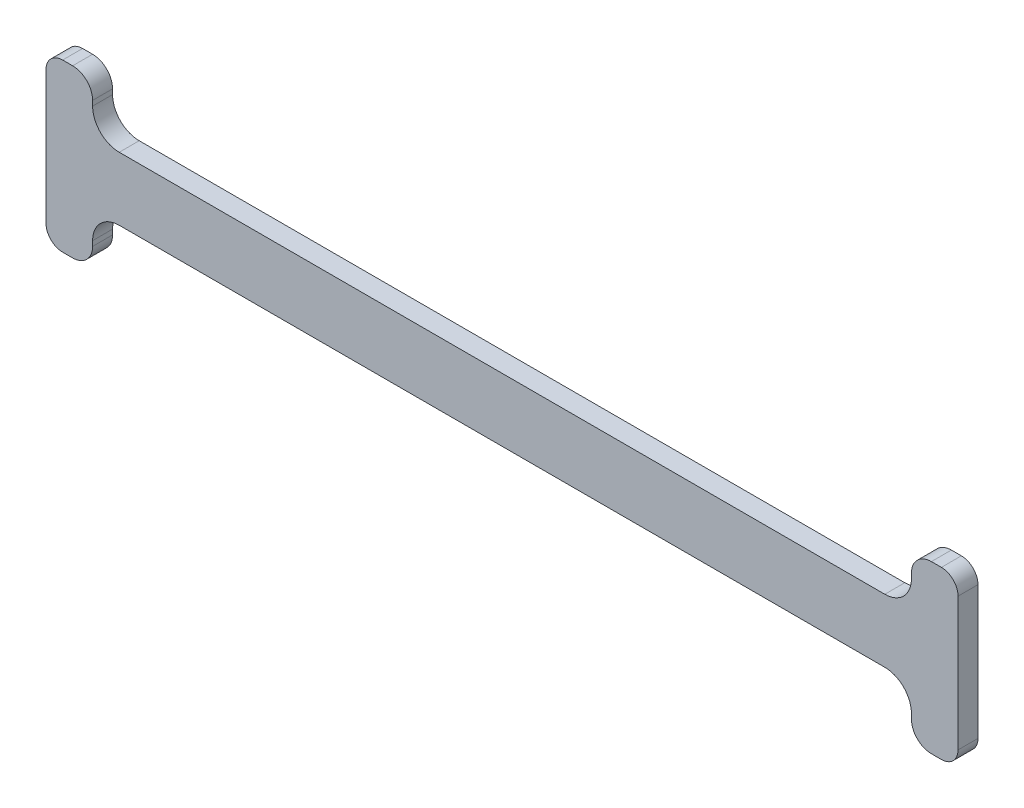
ISO-10303-21;
HEADER;
FILE_DESCRIPTION(('STEP AP214'),'2;1');
FILE_NAME('part.step','',(''),(''),'','','');
FILE_SCHEMA(('AUTOMOTIVE_DESIGN { 1 0 10303 214 1 1 1 1 }'));
ENDSEC;
DATA;
#1=APPLICATION_CONTEXT('core data for automotive mechanical design processes');
#2=APPLICATION_PROTOCOL_DEFINITION('international standard','automotive_design',2000,#1);
#3=PRODUCT_CONTEXT('',#1,'mechanical');
#4=PRODUCT('Part','Part','',(#3));
#5=PRODUCT_RELATED_PRODUCT_CATEGORY('part','',(#4));
#6=PRODUCT_DEFINITION_FORMATION('','',#4);
#7=PRODUCT_DEFINITION_CONTEXT('part definition',#1,'design');
#8=PRODUCT_DEFINITION('design','',#6,#7);
#9=PRODUCT_DEFINITION_SHAPE('','',#8);
#10=(LENGTH_UNIT() NAMED_UNIT(*) SI_UNIT(.MILLI.,.METRE.));
#11=(NAMED_UNIT(*) PLANE_ANGLE_UNIT() SI_UNIT($,.RADIAN.));
#12=(NAMED_UNIT(*) SI_UNIT($,.STERADIAN.) SOLID_ANGLE_UNIT());
#13=UNCERTAINTY_MEASURE_WITH_UNIT(LENGTH_MEASURE(1.E-05),#10,'distance_accuracy_value','');
#14=(GEOMETRIC_REPRESENTATION_CONTEXT(3) GLOBAL_UNCERTAINTY_ASSIGNED_CONTEXT((#13)) GLOBAL_UNIT_ASSIGNED_CONTEXT((#10,
#11,#12)) REPRESENTATION_CONTEXT('',''));
#15=CARTESIAN_POINT('',(0.,0.,0.));
#16=DIRECTION('',(0.,0.,1.));
#17=DIRECTION('',(1.,0.,0.));
#18=AXIS2_PLACEMENT_3D('',#15,#16,#17);
#19=CARTESIAN_POINT('',(1082.49799277824,802.036028313114,6.));
#20=DIRECTION('',(0.,1.,0.));
#21=DIRECTION('',(0.,0.,1.));
#22=AXIS2_PLACEMENT_3D('',#19,#20,#21);
#23=PLANE('',#22);
#24=DIRECTION('',(1.,0.,0.));
#25=VECTOR('',#24,1.);
#26=CARTESIAN_POINT('',(1082.49799277824,802.036028313114,0.));
#27=LINE('',#26,#25);
#28=CARTESIAN_POINT('',(1082.49799277824,802.036028313114,0.));
#29=VERTEX_POINT('',#28);
#30=CARTESIAN_POINT('',(1312.49799277825,802.036028313114,0.));
#31=VERTEX_POINT('',#30);
#32=EDGE_CURVE('E11',#29,#31,#27,.T.);
#33=ORIENTED_EDGE('',*,*,#32,.T.);
#34=DIRECTION('',(0.,0.,-1.));
#35=VECTOR('',#34,1.);
#36=CARTESIAN_POINT('',(1312.49799277825,802.036028313114,6.));
#37=LINE('',#36,#35);
#38=CARTESIAN_POINT('',(1312.49799277825,802.036028313114,6.));
#39=VERTEX_POINT('',#38);
#40=EDGE_CURVE('E54',#39,#31,#37,.T.);
#41=ORIENTED_EDGE('',*,*,#40,.F.);
#42=DIRECTION('',(1.,0.,0.));
#43=VECTOR('',#42,1.);
#44=CARTESIAN_POINT('',(1082.49799277824,802.036028313114,6.));
#45=LINE('',#44,#43);
#46=CARTESIAN_POINT('',(1082.49799277824,802.036028313114,6.));
#47=VERTEX_POINT('',#46);
#48=EDGE_CURVE('E39',#47,#39,#45,.T.);
#49=ORIENTED_EDGE('',*,*,#48,.F.);
#50=DIRECTION('',(0.,0.,-1.));
#51=VECTOR('',#50,1.);
#52=CARTESIAN_POINT('',(1082.49799277824,802.036028313114,6.));
#53=LINE('',#52,#51);
#54=EDGE_CURVE('E139',#47,#29,#53,.T.);
#55=ORIENTED_EDGE('',*,*,#54,.T.);
#56=EDGE_LOOP('',(#33,#41,#49,#55));
#57=FACE_BOUND('',#56,.T.);
#58=ADVANCED_FACE('F35',(#57),#23,.F.);
#59=CARTESIAN_POINT('',(1312.49799277825,794.036028312865,6.));
#60=DIRECTION('',(0.,0.,-1.));
#61=DIRECTION('',(-1.,0.,0.));
#62=AXIS2_PLACEMENT_3D('',#59,#60,#61);
#63=CYLINDRICAL_SURFACE('',#62,8.00000000024848);
#64=CARTESIAN_POINT('',(1312.49799277825,794.036028312865,0.));
#65=DIRECTION('',(0.,0.,1.));
#66=DIRECTION('',(1.,0.,0.));
#67=AXIS2_PLACEMENT_3D('',#64,#65,#66);
#68=CIRCLE('',#67,8.00000000024848);
#69=CARTESIAN_POINT('',(1320.4979927785,794.036028313431,0.));
#70=VERTEX_POINT('',#69);
#71=EDGE_CURVE('E45',#70,#31,#68,.T.);
#72=ORIENTED_EDGE('',*,*,#71,.F.);
#73=DIRECTION('',(0.,0.,-1.));
#74=VECTOR('',#73,1.);
#75=CARTESIAN_POINT('',(1320.4979927785,794.036028313431,6.));
#76=LINE('',#75,#74);
#77=CARTESIAN_POINT('',(1320.4979927785,794.036028313431,6.));
#78=VERTEX_POINT('',#77);
#79=EDGE_CURVE('E127',#78,#70,#76,.T.);
#80=ORIENTED_EDGE('',*,*,#79,.F.);
#81=CARTESIAN_POINT('',(1312.49799277825,794.036028312865,6.));
#82=DIRECTION('',(0.,0.,1.));
#83=DIRECTION('',(1.,0.,0.));
#84=AXIS2_PLACEMENT_3D('',#81,#82,#83);
#85=CIRCLE('',#84,8.00000000024848);
#86=EDGE_CURVE('E278',#78,#39,#85,.T.);
#87=ORIENTED_EDGE('',*,*,#86,.T.);
#88=ORIENTED_EDGE('',*,*,#40,.T.);
#89=EDGE_LOOP('',(#72,#80,#87,#88));
#90=FACE_BOUND('',#89,.T.);
#91=ADVANCED_FACE('F478',(#90),#63,.F.);
#92=CARTESIAN_POINT('',(1320.4979927785,794.036028313431,6.));
#93=DIRECTION('',(1.,0.,0.));
#94=DIRECTION('',(0.,0.,-1.));
#95=AXIS2_PLACEMENT_3D('',#92,#93,#94);
#96=PLANE('',#95);
#97=DIRECTION('',(0.,-1.,0.));
#98=VECTOR('',#97,1.);
#99=CARTESIAN_POINT('',(1320.4979927785,794.036028313431,0.));
#100=LINE('',#99,#98);
#101=CARTESIAN_POINT('',(1320.4979927785,792.536030360595,0.));
#102=VERTEX_POINT('',#101);
#103=EDGE_CURVE('E204',#70,#102,#100,.T.);
#104=ORIENTED_EDGE('',*,*,#103,.T.);
#105=DIRECTION('',(0.,0.,-1.));
#106=VECTOR('',#105,1.);
#107=CARTESIAN_POINT('',(1320.4979927785,792.536030360595,6.));
#108=LINE('',#107,#106);
#109=CARTESIAN_POINT('',(1320.4979927785,792.536030360595,6.));
#110=VERTEX_POINT('',#109);
#111=EDGE_CURVE('E207',#110,#102,#108,.T.);
#112=ORIENTED_EDGE('',*,*,#111,.F.);
#113=DIRECTION('',(0.,-1.,0.));
#114=VECTOR('',#113,1.);
#115=CARTESIAN_POINT('',(1320.4979927785,794.036028313431,6.));
#116=LINE('',#115,#114);
#117=EDGE_CURVE('E277',#78,#110,#116,.T.);
#118=ORIENTED_EDGE('',*,*,#117,.F.);
#119=ORIENTED_EDGE('',*,*,#79,.T.);
#120=EDGE_LOOP('',(#104,#112,#118,#119));
#121=FACE_BOUND('',#120,.T.);
#122=ADVANCED_FACE('F206',(#121),#96,.F.);
#123=CARTESIAN_POINT('',(1326.49799584903,792.53603138364,6.));
#124=DIRECTION('',(0.,0.,-1.));
#125=DIRECTION('',(-1.,0.,0.));
#126=AXIS2_PLACEMENT_3D('',#123,#124,#125);
#127=CYLINDRICAL_SURFACE('',#126,6.00000307052947);
#128=CARTESIAN_POINT('',(1326.49799584903,792.53603138364,0.));
#129=DIRECTION('',(0.,0.,1.));
#130=DIRECTION('',(1.,0.,0.));
#131=AXIS2_PLACEMENT_3D('',#128,#129,#130);
#132=CIRCLE('',#131,6.00000307052947);
#133=CARTESIAN_POINT('',(1326.49799397723,786.536028313111,0.));
#134=VERTEX_POINT('',#133);
#135=EDGE_CURVE('E212',#102,#134,#132,.T.);
#136=ORIENTED_EDGE('',*,*,#135,.T.);
#137=DIRECTION('',(0.,0.,-1.));
#138=VECTOR('',#137,1.);
#139=CARTESIAN_POINT('',(1326.49799397723,786.536028313111,6.));
#140=LINE('',#139,#138);
#141=CARTESIAN_POINT('',(1326.49799397723,786.536028313111,6.));
#142=VERTEX_POINT('',#141);
#143=EDGE_CURVE('E219',#142,#134,#140,.T.);
#144=ORIENTED_EDGE('',*,*,#143,.F.);
#145=CARTESIAN_POINT('',(1326.49799584903,792.53603138364,6.));
#146=DIRECTION('',(0.,0.,1.));
#147=DIRECTION('',(1.,0.,0.));
#148=AXIS2_PLACEMENT_3D('',#145,#146,#147);
#149=CIRCLE('',#148,6.00000307052947);
#150=EDGE_CURVE('E218',#110,#142,#149,.T.);
#151=ORIENTED_EDGE('',*,*,#150,.F.);
#152=ORIENTED_EDGE('',*,*,#111,.T.);
#153=EDGE_LOOP('',(#136,#144,#151,#152));
#154=FACE_BOUND('',#153,.T.);
#155=ADVANCED_FACE('F215',(#154),#127,.T.);
#156=CARTESIAN_POINT('',(1326.49799397723,786.536028313111,6.));
#157=DIRECTION('',(-6.34307674780926E-11,1.,0.));
#158=DIRECTION('',(-1.,-6.34307674780926E-11,0.));
#159=AXIS2_PLACEMENT_3D('',#156,#157,#158);
#160=PLANE('',#159);
#161=DIRECTION('',(1.,6.34307674780926E-11,0.));
#162=VECTOR('',#161,1.);
#163=CARTESIAN_POINT('',(1326.49799397723,786.536028313111,0.));
#164=LINE('',#163,#162);
#165=CARTESIAN_POINT('',(1329.49799277886,786.536028313301,0.));
#166=VERTEX_POINT('',#165);
#167=EDGE_CURVE('E224',#134,#166,#164,.T.);
#168=ORIENTED_EDGE('',*,*,#167,.T.);
#169=DIRECTION('',(0.,0.,-1.));
#170=VECTOR('',#169,1.);
#171=CARTESIAN_POINT('',(1329.49799277886,786.536028313301,6.));
#172=LINE('',#171,#170);
#173=CARTESIAN_POINT('',(1329.49799277886,786.536028313301,6.));
#174=VERTEX_POINT('',#173);
#175=EDGE_CURVE('E334',#174,#166,#172,.T.);
#176=ORIENTED_EDGE('',*,*,#175,.F.);
#177=DIRECTION('',(1.,6.34307674780926E-11,0.));
#178=VECTOR('',#177,1.);
#179=CARTESIAN_POINT('',(1326.49799397723,786.536028313111,6.));
#180=LINE('',#179,#178);
#181=EDGE_CURVE('E274',#142,#174,#180,.T.);
#182=ORIENTED_EDGE('',*,*,#181,.F.);
#183=ORIENTED_EDGE('',*,*,#143,.T.);
#184=EDGE_LOOP('',(#168,#176,#182,#183));
#185=FACE_BOUND('',#184,.T.);
#186=ADVANCED_FACE('F466',(#185),#160,.F.);
#187=CARTESIAN_POINT('',(1329.49799277854,791.536028313301,6.));
#188=DIRECTION('',(0.,0.,-1.));
#189=DIRECTION('',(-1.,0.,0.));
#190=AXIS2_PLACEMENT_3D('',#187,#188,#189);
#191=CYLINDRICAL_SURFACE('',#190,5.00000000000006);
#192=CARTESIAN_POINT('',(1329.49799277854,791.536028313301,0.));
#193=DIRECTION('',(0.,0.,1.));
#194=DIRECTION('',(1.,0.,0.));
#195=AXIS2_PLACEMENT_3D('',#192,#193,#194);
#196=CIRCLE('',#195,5.00000000000006);
#197=CARTESIAN_POINT('',(1334.49799277854,791.536028313302,0.));
#198=VERTEX_POINT('',#197);
#199=EDGE_CURVE('E226',#166,#198,#196,.T.);
#200=ORIENTED_EDGE('',*,*,#199,.T.);
#201=DIRECTION('',(0.,0.,-1.));
#202=VECTOR('',#201,1.);
#203=CARTESIAN_POINT('',(1334.49799277854,791.536028313302,6.));
#204=LINE('',#203,#202);
#205=CARTESIAN_POINT('',(1334.49799277854,791.536028313302,6.));
#206=VERTEX_POINT('',#205);
#207=EDGE_CURVE('E332',#206,#198,#204,.T.);
#208=ORIENTED_EDGE('',*,*,#207,.F.);
#209=CARTESIAN_POINT('',(1329.49799277854,791.536028313301,6.));
#210=DIRECTION('',(0.,0.,1.));
#211=DIRECTION('',(1.,0.,0.));
#212=AXIS2_PLACEMENT_3D('',#209,#210,#211);
#213=CIRCLE('',#212,5.00000000000006);
#214=EDGE_CURVE('E272',#174,#206,#213,.T.);
#215=ORIENTED_EDGE('',*,*,#214,.F.);
#216=ORIENTED_EDGE('',*,*,#175,.T.);
#217=EDGE_LOOP('',(#200,#208,#215,#216));
#218=FACE_BOUND('',#217,.T.);
#219=ADVANCED_FACE('F330',(#218),#191,.T.);
#220=CARTESIAN_POINT('',(1334.49799277854,831.536028313114,6.));
#221=DIRECTION('',(1.,0.,0.));
#222=DIRECTION('',(0.,0.,-1.));
#223=AXIS2_PLACEMENT_3D('',#220,#221,#222);
#224=PLANE('',#223);
#225=DIRECTION('',(0.,-1.,0.));
#226=VECTOR('',#225,1.);
#227=CARTESIAN_POINT('',(1334.49799277854,831.536028313114,0.));
#228=LINE('',#227,#226);
#229=CARTESIAN_POINT('',(1334.49799277854,831.536028313114,0.));
#230=VERTEX_POINT('',#229);
#231=EDGE_CURVE('E324',#230,#198,#228,.T.);
#232=ORIENTED_EDGE('',*,*,#231,.F.);
#233=DIRECTION('',(0.,0.,-1.));
#234=VECTOR('',#233,1.);
#235=CARTESIAN_POINT('',(1334.49799277854,831.536028313114,6.));
#236=LINE('',#235,#234);
#237=CARTESIAN_POINT('',(1334.49799277854,831.536028313114,6.));
#238=VERTEX_POINT('',#237);
#239=EDGE_CURVE('E340',#238,#230,#236,.T.);
#240=ORIENTED_EDGE('',*,*,#239,.F.);
#241=DIRECTION('',(0.,-1.,0.));
#242=VECTOR('',#241,1.);
#243=CARTESIAN_POINT('',(1334.49799277854,831.536028313114,6.));
#244=LINE('',#243,#242);
#245=EDGE_CURVE('E269',#238,#206,#244,.T.);
#246=ORIENTED_EDGE('',*,*,#245,.T.);
#247=ORIENTED_EDGE('',*,*,#207,.T.);
#248=EDGE_LOOP('',(#232,#240,#246,#247));
#249=FACE_BOUND('',#248,.T.);
#250=ADVANCED_FACE('F339',(#249),#224,.T.);
#251=CARTESIAN_POINT('',(1329.49799277854,831.536028313114,6.));
#252=DIRECTION('',(0.,0.,-1.));
#253=DIRECTION('',(-1.,0.,0.));
#254=AXIS2_PLACEMENT_3D('',#251,#252,#253);
#255=CYLINDRICAL_SURFACE('',#254,5.);
#256=CARTESIAN_POINT('',(1329.49799277854,831.536028313114,0.));
#257=DIRECTION('',(0.,0.,1.));
#258=DIRECTION('',(1.,0.,0.));
#259=AXIS2_PLACEMENT_3D('',#256,#257,#258);
#260=CIRCLE('',#259,5.);
#261=CARTESIAN_POINT('',(1329.49799277854,836.536028313114,0.));
#262=VERTEX_POINT('',#261);
#263=EDGE_CURVE('E322',#230,#262,#260,.T.);
#264=ORIENTED_EDGE('',*,*,#263,.T.);
#265=DIRECTION('',(0.,0.,-1.));
#266=VECTOR('',#265,1.);
#267=CARTESIAN_POINT('',(1329.49799277854,836.536028313114,6.));
#268=LINE('',#267,#266);
#269=CARTESIAN_POINT('',(1329.49799277854,836.536028313114,6.));
#270=VERTEX_POINT('',#269);
#271=EDGE_CURVE('E344',#270,#262,#268,.T.);
#272=ORIENTED_EDGE('',*,*,#271,.F.);
#273=CARTESIAN_POINT('',(1329.49799277854,831.536028313114,6.));
#274=DIRECTION('',(0.,0.,1.));
#275=DIRECTION('',(1.,0.,0.));
#276=AXIS2_PLACEMENT_3D('',#273,#274,#275);
#277=CIRCLE('',#276,5.);
#278=EDGE_CURVE('E267',#238,#270,#277,.T.);
#279=ORIENTED_EDGE('',*,*,#278,.F.);
#280=ORIENTED_EDGE('',*,*,#239,.T.);
#281=EDGE_LOOP('',(#264,#272,#279,#280));
#282=FACE_BOUND('',#281,.T.);
#283=ADVANCED_FACE('F463',(#282),#255,.T.);
#284=CARTESIAN_POINT('',(1329.49799277854,836.536028313114,6.));
#285=DIRECTION('',(2.96059473226659E-13,-1.,0.));
#286=DIRECTION('',(1.,2.96059473226659E-13,0.));
#287=AXIS2_PLACEMENT_3D('',#284,#285,#286);
#288=PLANE('',#287);
#289=DIRECTION('',(-1.,-2.96059473226659E-13,0.));
#290=VECTOR('',#289,1.);
#291=CARTESIAN_POINT('',(1329.49799277854,836.536028313114,0.));
#292=LINE('',#291,#290);
#293=CARTESIAN_POINT('',(1326.49799277847,836.536028313113,0.));
#294=VERTEX_POINT('',#293);
#295=EDGE_CURVE('E320',#262,#294,#292,.T.);
#296=ORIENTED_EDGE('',*,*,#295,.T.);
#297=DIRECTION('',(0.,0.,-1.));
#298=VECTOR('',#297,1.);
#299=CARTESIAN_POINT('',(1326.49799277847,836.536028313113,6.));
#300=LINE('',#299,#298);
#301=CARTESIAN_POINT('',(1326.49799277847,836.536028313113,6.));
#302=VERTEX_POINT('',#301);
#303=EDGE_CURVE('E351',#302,#294,#300,.T.);
#304=ORIENTED_EDGE('',*,*,#303,.F.);
#305=DIRECTION('',(-1.,-2.96059473226659E-13,0.));
#306=VECTOR('',#305,1.);
#307=CARTESIAN_POINT('',(1329.49799277854,836.536028313114,6.));
#308=LINE('',#307,#306);
#309=EDGE_CURVE('E265',#270,#302,#308,.T.);
#310=ORIENTED_EDGE('',*,*,#309,.F.);
#311=ORIENTED_EDGE('',*,*,#271,.T.);
#312=EDGE_LOOP('',(#296,#304,#310,#311));
#313=FACE_BOUND('',#312,.T.);
#314=ADVANCED_FACE('F460',(#313),#288,.F.);
#315=CARTESIAN_POINT('',(1326.49799277847,830.536028313227,6.));
#316=DIRECTION('',(0.,0.,-1.));
#317=DIRECTION('',(-1.,0.,0.));
#318=AXIS2_PLACEMENT_3D('',#315,#316,#317);
#319=CYLINDRICAL_SURFACE('',#318,5.99999999988565);
#320=CARTESIAN_POINT('',(1326.49799277847,830.536028313227,0.));
#321=DIRECTION('',(0.,0.,1.));
#322=DIRECTION('',(1.,0.,0.));
#323=AXIS2_PLACEMENT_3D('',#320,#321,#322);
#324=CIRCLE('',#323,5.99999999988565);
#325=CARTESIAN_POINT('',(1320.49799277859,830.536028312992,0.));
#326=VERTEX_POINT('',#325);
#327=EDGE_CURVE('E318',#294,#326,#324,.T.);
#328=ORIENTED_EDGE('',*,*,#327,.T.);
#329=DIRECTION('',(0.,0.,-1.));
#330=VECTOR('',#329,1.);
#331=CARTESIAN_POINT('',(1320.49799277859,830.536028312992,6.));
#332=LINE('',#331,#330);
#333=CARTESIAN_POINT('',(1320.49799277859,830.536028312992,6.));
#334=VERTEX_POINT('',#333);
#335=EDGE_CURVE('E354',#334,#326,#332,.T.);
#336=ORIENTED_EDGE('',*,*,#335,.F.);
#337=CARTESIAN_POINT('',(1326.49799277847,830.536028313227,6.));
#338=DIRECTION('',(0.,0.,1.));
#339=DIRECTION('',(1.,0.,0.));
#340=AXIS2_PLACEMENT_3D('',#337,#338,#339);
#341=CIRCLE('',#340,5.99999999988565);
#342=EDGE_CURVE('E263',#302,#334,#341,.T.);
#343=ORIENTED_EDGE('',*,*,#342,.F.);
#344=ORIENTED_EDGE('',*,*,#303,.T.);
#345=EDGE_LOOP('',(#328,#336,#343,#344));
#346=FACE_BOUND('',#345,.T.);
#347=ADVANCED_FACE('F455',(#346),#319,.T.);
#348=CARTESIAN_POINT('',(1320.49799277859,830.536028312992,6.));
#349=DIRECTION('',(1.,-4.14483261969322E-12,0.));
#350=DIRECTION('',(4.14483261969322E-12,1.,0.));
#351=AXIS2_PLACEMENT_3D('',#348,#349,#350);
#352=PLANE('',#351);
#353=DIRECTION('',(-4.14483261969322E-12,-1.,0.));
#354=VECTOR('',#353,1.);
#355=CARTESIAN_POINT('',(1320.49799277859,830.536028312992,0.));
#356=LINE('',#355,#354);
#357=CARTESIAN_POINT('',(1320.49799277858,829.036028310975,0.));
#358=VERTEX_POINT('',#357);
#359=EDGE_CURVE('E315',#326,#358,#356,.T.);
#360=ORIENTED_EDGE('',*,*,#359,.T.);
#361=DIRECTION('',(0.,0.,-1.));
#362=VECTOR('',#361,1.);
#363=CARTESIAN_POINT('',(1320.49799277858,829.036028310975,6.));
#364=LINE('',#363,#362);
#365=CARTESIAN_POINT('',(1320.49799277858,829.036028310975,6.));
#366=VERTEX_POINT('',#365);
#367=EDGE_CURVE('E357',#366,#358,#364,.T.);
#368=ORIENTED_EDGE('',*,*,#367,.F.);
#369=DIRECTION('',(-4.14483261969322E-12,-1.,0.));
#370=VECTOR('',#369,1.);
#371=CARTESIAN_POINT('',(1320.49799277859,830.536028312992,6.));
#372=LINE('',#371,#370);
#373=EDGE_CURVE('E261',#334,#366,#372,.T.);
#374=ORIENTED_EDGE('',*,*,#373,.F.);
#375=ORIENTED_EDGE('',*,*,#335,.T.);
#376=EDGE_LOOP('',(#360,#368,#374,#375));
#377=FACE_BOUND('',#376,.T.);
#378=ADVANCED_FACE('F451',(#377),#352,.F.);
#379=CARTESIAN_POINT('',(1312.49798980979,829.0360312819,6.));
#380=DIRECTION('',(0.,0.,-1.));
#381=DIRECTION('',(-1.,0.,0.));
#382=AXIS2_PLACEMENT_3D('',#379,#380,#381);
#383=CYLINDRICAL_SURFACE('',#382,8.00000296878849);
#384=CARTESIAN_POINT('',(1312.49798980979,829.0360312819,0.));
#385=DIRECTION('',(0.,0.,1.));
#386=DIRECTION('',(1.,0.,0.));
#387=AXIS2_PLACEMENT_3D('',#384,#385,#386);
#388=CIRCLE('',#387,8.00000296878849);
#389=CARTESIAN_POINT('',(1312.49799103713,821.036028313112,0.));
#390=VERTEX_POINT('',#389);
#391=EDGE_CURVE('E312',#390,#358,#388,.T.);
#392=ORIENTED_EDGE('',*,*,#391,.F.);
#393=DIRECTION('',(0.,0.,-1.));
#394=VECTOR('',#393,1.);
#395=CARTESIAN_POINT('',(1312.49799103713,821.036028313112,6.));
#396=LINE('',#395,#394);
#397=CARTESIAN_POINT('',(1312.49799103713,821.036028313112,6.));
#398=VERTEX_POINT('',#397);
#399=EDGE_CURVE('E359',#398,#390,#396,.T.);
#400=ORIENTED_EDGE('',*,*,#399,.F.);
#401=CARTESIAN_POINT('',(1312.49798980979,829.0360312819,6.));
#402=DIRECTION('',(0.,0.,1.));
#403=DIRECTION('',(1.,0.,0.));
#404=AXIS2_PLACEMENT_3D('',#401,#402,#403);
#405=CIRCLE('',#404,8.00000296878849);
#406=EDGE_CURVE('E258',#398,#366,#405,.T.);
#407=ORIENTED_EDGE('',*,*,#406,.T.);
#408=ORIENTED_EDGE('',*,*,#367,.T.);
#409=EDGE_LOOP('',(#392,#400,#407,#408));
#410=FACE_BOUND('',#409,.T.);
#411=ADVANCED_FACE('F447',(#410),#383,.F.);
#412=CARTESIAN_POINT('',(1082.49799489582,821.03602831311,6.));
#413=DIRECTION('',(0.,1.,0.));
#414=DIRECTION('',(-1.,0.,0.));
#415=AXIS2_PLACEMENT_3D('',#412,#413,#414);
#416=PLANE('',#415);
#417=DIRECTION('',(1.,0.,0.));
#418=VECTOR('',#417,1.);
#419=CARTESIAN_POINT('',(1082.49799489582,821.03602831311,0.));
#420=LINE('',#419,#418);
#421=CARTESIAN_POINT('',(1082.49799489582,821.03602831311,0.));
#422=VERTEX_POINT('',#421);
#423=EDGE_CURVE('E309',#422,#390,#420,.T.);
#424=ORIENTED_EDGE('',*,*,#423,.F.);
#425=DIRECTION('',(0.,0.,-1.));
#426=VECTOR('',#425,1.);
#427=CARTESIAN_POINT('',(1082.49799489582,821.03602831311,6.));
#428=LINE('',#427,#426);
#429=CARTESIAN_POINT('',(1082.49799489582,821.03602831311,6.));
#430=VERTEX_POINT('',#429);
#431=EDGE_CURVE('E361',#430,#422,#428,.T.);
#432=ORIENTED_EDGE('',*,*,#431,.F.);
#433=DIRECTION('',(1.,0.,0.));
#434=VECTOR('',#433,1.);
#435=CARTESIAN_POINT('',(1082.49799489582,821.03602831311,6.));
#436=LINE('',#435,#434);
#437=EDGE_CURVE('E255',#430,#398,#436,.T.);
#438=ORIENTED_EDGE('',*,*,#437,.T.);
#439=ORIENTED_EDGE('',*,*,#399,.T.);
#440=EDGE_LOOP('',(#424,#432,#438,#439));
#441=FACE_BOUND('',#440,.T.);
#442=ADVANCED_FACE('F443',(#441),#416,.T.);
#443=CARTESIAN_POINT('',(1082.49799639425,829.036031928977,6.));
#444=DIRECTION('',(0.,0.,-1.));
#445=DIRECTION('',(-1.,0.,0.));
#446=AXIS2_PLACEMENT_3D('',#443,#444,#445);
#447=CYLINDRICAL_SURFACE('',#446,8.00000361586648);
#448=CARTESIAN_POINT('',(1082.49799639425,829.036031928977,0.));
#449=DIRECTION('',(0.,0.,1.));
#450=DIRECTION('',(1.,0.,0.));
#451=AXIS2_PLACEMENT_3D('',#448,#449,#450);
#452=CIRCLE('',#451,8.00000361586648);
#453=CARTESIAN_POINT('',(1074.49799277839,829.036028313881,0.));
#454=VERTEX_POINT('',#453);
#455=EDGE_CURVE('E306',#454,#422,#452,.T.);
#456=ORIENTED_EDGE('',*,*,#455,.F.);
#457=DIRECTION('',(0.,0.,-1.));
#458=VECTOR('',#457,1.);
#459=CARTESIAN_POINT('',(1074.49799277839,829.036028313881,6.));
#460=LINE('',#459,#458);
#461=CARTESIAN_POINT('',(1074.49799277839,829.036028313881,6.));
#462=VERTEX_POINT('',#461);
#463=EDGE_CURVE('E363',#462,#454,#460,.T.);
#464=ORIENTED_EDGE('',*,*,#463,.F.);
#465=CARTESIAN_POINT('',(1082.49799639425,829.036031928977,6.));
#466=DIRECTION('',(0.,0.,1.));
#467=DIRECTION('',(1.,0.,0.));
#468=AXIS2_PLACEMENT_3D('',#465,#466,#467);
#469=CIRCLE('',#468,8.00000361586648);
#470=EDGE_CURVE('E252',#462,#430,#469,.T.);
#471=ORIENTED_EDGE('',*,*,#470,.T.);
#472=ORIENTED_EDGE('',*,*,#431,.T.);
#473=EDGE_LOOP('',(#456,#464,#471,#472));
#474=FACE_BOUND('',#473,.T.);
#475=ADVANCED_FACE('F438',(#474),#447,.F.);
#476=CARTESIAN_POINT('',(1074.49799277839,829.036028313881,6.));
#477=DIRECTION('',(-1.,7.26826007219083E-11,0.));
#478=DIRECTION('',(-7.26826007219083E-11,-1.,0.));
#479=AXIS2_PLACEMENT_3D('',#476,#477,#478);
#480=PLANE('',#479);
#481=DIRECTION('',(7.26826007219083E-11,1.,0.));
#482=VECTOR('',#481,1.);
#483=CARTESIAN_POINT('',(1074.49799277839,829.036028313881,0.));
#484=LINE('',#483,#482);
#485=CARTESIAN_POINT('',(1074.4979927785,830.536028312992,0.));
#486=VERTEX_POINT('',#485);
#487=EDGE_CURVE('E304',#454,#486,#484,.T.);
#488=ORIENTED_EDGE('',*,*,#487,.T.);
#489=DIRECTION('',(0.,0.,-1.));
#490=VECTOR('',#489,1.);
#491=CARTESIAN_POINT('',(1074.4979927785,830.536028312992,6.));
#492=LINE('',#491,#490);
#493=CARTESIAN_POINT('',(1074.4979927785,830.536028312992,6.));
#494=VERTEX_POINT('',#493);
#495=EDGE_CURVE('E365',#494,#486,#492,.T.);
#496=ORIENTED_EDGE('',*,*,#495,.F.);
#497=DIRECTION('',(7.26826007219083E-11,1.,0.));
#498=VECTOR('',#497,1.);
#499=CARTESIAN_POINT('',(1074.49799277839,829.036028313881,6.));
#500=LINE('',#499,#498);
#501=EDGE_CURVE('E250',#462,#494,#500,.T.);
#502=ORIENTED_EDGE('',*,*,#501,.F.);
#503=ORIENTED_EDGE('',*,*,#463,.T.);
#504=EDGE_LOOP('',(#488,#496,#502,#503));
#505=FACE_BOUND('',#504,.T.);
#506=ADVANCED_FACE('F435',(#505),#480,.F.);
#507=CARTESIAN_POINT('',(1068.49799277861,830.536028313227,6.));
#508=DIRECTION('',(0.,0.,-1.));
#509=DIRECTION('',(-1.,0.,0.));
#510=AXIS2_PLACEMENT_3D('',#507,#508,#509);
#511=CYLINDRICAL_SURFACE('',#510,5.99999999988587);
#512=CARTESIAN_POINT('',(1068.49799277861,830.536028313227,0.));
#513=DIRECTION('',(0.,0.,1.));
#514=DIRECTION('',(1.,0.,0.));
#515=AXIS2_PLACEMENT_3D('',#512,#513,#514);
#516=CIRCLE('',#515,5.99999999988587);
#517=CARTESIAN_POINT('',(1068.49799277861,836.536028313113,0.));
#518=VERTEX_POINT('',#517);
#519=EDGE_CURVE('E302',#486,#518,#516,.T.);
#520=ORIENTED_EDGE('',*,*,#519,.T.);
#521=DIRECTION('',(0.,0.,-1.));
#522=VECTOR('',#521,1.);
#523=CARTESIAN_POINT('',(1068.49799277861,836.536028313113,6.));
#524=LINE('',#523,#522);
#525=CARTESIAN_POINT('',(1068.49799277861,836.536028313113,6.));
#526=VERTEX_POINT('',#525);
#527=EDGE_CURVE('E368',#526,#518,#524,.T.);
#528=ORIENTED_EDGE('',*,*,#527,.F.);
#529=CARTESIAN_POINT('',(1068.49799277861,830.536028313227,6.));
#530=DIRECTION('',(0.,0.,1.));
#531=DIRECTION('',(1.,0.,0.));
#532=AXIS2_PLACEMENT_3D('',#529,#530,#531);
#533=CIRCLE('',#532,5.99999999988587);
#534=EDGE_CURVE('E248',#494,#526,#533,.T.);
#535=ORIENTED_EDGE('',*,*,#534,.F.);
#536=ORIENTED_EDGE('',*,*,#495,.T.);
#537=EDGE_LOOP('',(#520,#528,#535,#536));
#538=FACE_BOUND('',#537,.T.);
#539=ADVANCED_FACE('F430',(#538),#511,.T.);
#540=CARTESIAN_POINT('',(1068.49799277861,836.536028313113,6.));
#541=DIRECTION('',(6.2357526541885E-11,-1.,0.));
#542=DIRECTION('',(1.,6.2357526541885E-11,0.));
#543=AXIS2_PLACEMENT_3D('',#540,#541,#542);
#544=PLANE('',#543);
#545=DIRECTION('',(-1.,-6.2357526541885E-11,0.));
#546=VECTOR('',#545,1.);
#547=CARTESIAN_POINT('',(1068.49799277861,836.536028313113,0.));
#548=LINE('',#547,#546);
#549=CARTESIAN_POINT('',(1065.49799277823,836.536028312926,0.));
#550=VERTEX_POINT('',#549);
#551=EDGE_CURVE('E300',#518,#550,#548,.T.);
#552=ORIENTED_EDGE('',*,*,#551,.T.);
#553=DIRECTION('',(0.,0.,-1.));
#554=VECTOR('',#553,1.);
#555=CARTESIAN_POINT('',(1065.49799277823,836.536028312926,6.));
#556=LINE('',#555,#554);
#557=CARTESIAN_POINT('',(1065.49799277823,836.536028312926,6.));
#558=VERTEX_POINT('',#557);
#559=EDGE_CURVE('E371',#558,#550,#556,.T.);
#560=ORIENTED_EDGE('',*,*,#559,.F.);
#561=DIRECTION('',(-1.,-6.2357526541885E-11,0.));
#562=VECTOR('',#561,1.);
#563=CARTESIAN_POINT('',(1068.49799277861,836.536028313113,6.));
#564=LINE('',#563,#562);
#565=EDGE_CURVE('E246',#526,#558,#564,.T.);
#566=ORIENTED_EDGE('',*,*,#565,.F.);
#567=ORIENTED_EDGE('',*,*,#527,.T.);
#568=EDGE_LOOP('',(#552,#560,#566,#567));
#569=FACE_BOUND('',#568,.T.);
#570=ADVANCED_FACE('F424',(#569),#544,.F.);
#571=CARTESIAN_POINT('',(1065.49799277854,831.536028312926,6.));
#572=DIRECTION('',(0.,0.,-1.));
#573=DIRECTION('',(-1.,0.,0.));
#574=AXIS2_PLACEMENT_3D('',#571,#572,#573);
#575=CYLINDRICAL_SURFACE('',#574,5.00000000000006);
#576=CARTESIAN_POINT('',(1065.49799277854,831.536028312926,0.));
#577=DIRECTION('',(0.,0.,1.));
#578=DIRECTION('',(1.,0.,0.));
#579=AXIS2_PLACEMENT_3D('',#576,#577,#578);
#580=CIRCLE('',#579,5.00000000000006);
#581=CARTESIAN_POINT('',(1060.49799277854,831.536028312926,0.));
#582=VERTEX_POINT('',#581);
#583=EDGE_CURVE('E298',#550,#582,#580,.T.);
#584=ORIENTED_EDGE('',*,*,#583,.T.);
#585=DIRECTION('',(0.,0.,-1.));
#586=VECTOR('',#585,1.);
#587=CARTESIAN_POINT('',(1060.49799277854,831.536028312926,6.));
#588=LINE('',#587,#586);
#589=CARTESIAN_POINT('',(1060.49799277854,831.536028312926,6.));
#590=VERTEX_POINT('',#589);
#591=EDGE_CURVE('E374',#590,#582,#588,.T.);
#592=ORIENTED_EDGE('',*,*,#591,.F.);
#593=CARTESIAN_POINT('',(1065.49799277854,831.536028312926,6.));
#594=DIRECTION('',(0.,0.,1.));
#595=DIRECTION('',(1.,0.,0.));
#596=AXIS2_PLACEMENT_3D('',#593,#594,#595);
#597=CIRCLE('',#596,5.00000000000006);
#598=EDGE_CURVE('E244',#558,#590,#597,.T.);
#599=ORIENTED_EDGE('',*,*,#598,.F.);
#600=ORIENTED_EDGE('',*,*,#559,.T.);
#601=EDGE_LOOP('',(#584,#592,#599,#600));
#602=FACE_BOUND('',#601,.T.);
#603=ADVANCED_FACE('F420',(#602),#575,.T.);
#604=CARTESIAN_POINT('',(1060.49799277854,831.536028312926,6.));
#605=DIRECTION('',(1.,0.,0.));
#606=DIRECTION('',(0.,0.,-1.));
#607=AXIS2_PLACEMENT_3D('',#604,#605,#606);
#608=PLANE('',#607);
#609=DIRECTION('',(0.,-1.,0.));
#610=VECTOR('',#609,1.);
#611=CARTESIAN_POINT('',(1060.49799277854,831.536028312926,0.));
#612=LINE('',#611,#610);
#613=CARTESIAN_POINT('',(1060.49799277854,791.536028313301,0.));
#614=VERTEX_POINT('',#613);
#615=EDGE_CURVE('E296',#582,#614,#612,.T.);
#616=ORIENTED_EDGE('',*,*,#615,.T.);
#617=DIRECTION('',(0.,0.,-1.));
#618=VECTOR('',#617,1.);
#619=CARTESIAN_POINT('',(1060.49799277854,791.536028313301,6.));
#620=LINE('',#619,#618);
#621=CARTESIAN_POINT('',(1060.49799277854,791.536028313301,6.));
#622=VERTEX_POINT('',#621);
#623=EDGE_CURVE('E377',#622,#614,#620,.T.);
#624=ORIENTED_EDGE('',*,*,#623,.F.);
#625=DIRECTION('',(0.,-1.,0.));
#626=VECTOR('',#625,1.);
#627=CARTESIAN_POINT('',(1060.49799277854,831.536028312926,6.));
#628=LINE('',#627,#626);
#629=EDGE_CURVE('E242',#590,#622,#628,.T.);
#630=ORIENTED_EDGE('',*,*,#629,.F.);
#631=ORIENTED_EDGE('',*,*,#591,.T.);
#632=EDGE_LOOP('',(#616,#624,#630,#631));
#633=FACE_BOUND('',#632,.T.);
#634=ADVANCED_FACE('F415',(#633),#608,.F.);
#635=CARTESIAN_POINT('',(1065.49799277854,791.536028313301,6.));
#636=DIRECTION('',(0.,0.,-1.));
#637=DIRECTION('',(-1.,0.,0.));
#638=AXIS2_PLACEMENT_3D('',#635,#636,#637);
#639=CYLINDRICAL_SURFACE('',#638,5.00000000000012);
#640=CARTESIAN_POINT('',(1065.49799277854,791.536028313301,0.));
#641=DIRECTION('',(0.,0.,1.));
#642=DIRECTION('',(1.,0.,0.));
#643=AXIS2_PLACEMENT_3D('',#640,#641,#642);
#644=CIRCLE('',#643,5.00000000000012);
#645=CARTESIAN_POINT('',(1065.49799277823,786.536028313301,0.));
#646=VERTEX_POINT('',#645);
#647=EDGE_CURVE('E294',#614,#646,#644,.T.);
#648=ORIENTED_EDGE('',*,*,#647,.T.);
#649=DIRECTION('',(0.,0.,-1.));
#650=VECTOR('',#649,1.);
#651=CARTESIAN_POINT('',(1065.49799277823,786.536028313301,6.));
#652=LINE('',#651,#650);
#653=CARTESIAN_POINT('',(1065.49799277823,786.536028313301,6.));
#654=VERTEX_POINT('',#653);
#655=EDGE_CURVE('E380',#654,#646,#652,.T.);
#656=ORIENTED_EDGE('',*,*,#655,.F.);
#657=CARTESIAN_POINT('',(1065.49799277854,791.536028313301,6.));
#658=DIRECTION('',(0.,0.,1.));
#659=DIRECTION('',(1.,0.,0.));
#660=AXIS2_PLACEMENT_3D('',#657,#658,#659);
#661=CIRCLE('',#660,5.00000000000012);
#662=EDGE_CURVE('E240',#622,#654,#661,.T.);
#663=ORIENTED_EDGE('',*,*,#662,.F.);
#664=ORIENTED_EDGE('',*,*,#623,.T.);
#665=EDGE_LOOP('',(#648,#656,#663,#664));
#666=FACE_BOUND('',#665,.T.);
#667=ADVANCED_FACE('F409',(#666),#639,.T.);
#668=CARTESIAN_POINT('',(1065.49799277823,786.536028313301,6.));
#669=DIRECTION('',(6.343076749321E-11,1.,0.));
#670=DIRECTION('',(-1.,6.343076749321E-11,0.));
#671=AXIS2_PLACEMENT_3D('',#668,#669,#670);
#672=PLANE('',#671);
#673=DIRECTION('',(1.,-6.34307674932099E-11,0.));
#674=VECTOR('',#673,1.);
#675=CARTESIAN_POINT('',(1065.49799277823,786.536028313301,0.));
#676=LINE('',#675,#674);
#677=CARTESIAN_POINT('',(1068.49799157914,786.536028313111,0.));
#678=VERTEX_POINT('',#677);
#679=EDGE_CURVE('E292',#646,#678,#676,.T.);
#680=ORIENTED_EDGE('',*,*,#679,.T.);
#681=DIRECTION('',(0.,0.,-1.));
#682=VECTOR('',#681,1.);
#683=CARTESIAN_POINT('',(1068.49799157914,786.536028313111,6.));
#684=LINE('',#683,#682);
#685=CARTESIAN_POINT('',(1068.49799157914,786.536028313111,6.));
#686=VERTEX_POINT('',#685);
#687=EDGE_CURVE('E383',#686,#678,#684,.T.);
#688=ORIENTED_EDGE('',*,*,#687,.F.);
#689=DIRECTION('',(1.,-6.34307674932099E-11,0.));
#690=VECTOR('',#689,1.);
#691=CARTESIAN_POINT('',(1065.49799277823,786.536028313301,6.));
#692=LINE('',#691,#690);
#693=EDGE_CURVE('E238',#654,#686,#692,.T.);
#694=ORIENTED_EDGE('',*,*,#693,.F.);
#695=ORIENTED_EDGE('',*,*,#655,.T.);
#696=EDGE_LOOP('',(#680,#688,#694,#695));
#697=FACE_BOUND('',#696,.T.);
#698=ADVANCED_FACE('F405',(#697),#672,.F.);
#699=CARTESIAN_POINT('',(1068.49799073095,792.536030360739,6.));
#700=DIRECTION('',(0.,0.,-1.));
#701=DIRECTION('',(-1.,0.,0.));
#702=AXIS2_PLACEMENT_3D('',#699,#700,#701);
#703=CYLINDRICAL_SURFACE('',#702,6.00000204762794);
#704=CARTESIAN_POINT('',(1068.49799073095,792.536030360739,0.));
#705=DIRECTION('',(0.,0.,1.));
#706=DIRECTION('',(1.,0.,0.));
#707=AXIS2_PLACEMENT_3D('',#704,#705,#706);
#708=CIRCLE('',#707,6.00000204762794);
#709=CARTESIAN_POINT('',(1074.49799277858,792.536028313425,0.));
#710=VERTEX_POINT('',#709);
#711=EDGE_CURVE('E286',#678,#710,#708,.T.);
#712=ORIENTED_EDGE('',*,*,#711,.T.);
#713=DIRECTION('',(0.,0.,-1.));
#714=VECTOR('',#713,1.);
#715=CARTESIAN_POINT('',(1074.49799277858,792.536028313425,6.));
#716=LINE('',#715,#714);
#717=CARTESIAN_POINT('',(1074.49799277858,792.536028313425,6.));
#718=VERTEX_POINT('',#717);
#719=EDGE_CURVE('E386',#718,#710,#716,.T.);
#720=ORIENTED_EDGE('',*,*,#719,.F.);
#721=CARTESIAN_POINT('',(1068.49799073095,792.536030360739,6.));
#722=DIRECTION('',(0.,0.,1.));
#723=DIRECTION('',(1.,0.,0.));
#724=AXIS2_PLACEMENT_3D('',#721,#722,#723);
#725=CIRCLE('',#724,6.00000204762794);
#726=EDGE_CURVE('E236',#686,#718,#725,.T.);
#727=ORIENTED_EDGE('',*,*,#726,.F.);
#728=ORIENTED_EDGE('',*,*,#687,.T.);
#729=EDGE_LOOP('',(#712,#720,#727,#728));
#730=FACE_BOUND('',#729,.T.);
#731=ADVANCED_FACE('F400',(#730),#703,.T.);
#732=CARTESIAN_POINT('',(1074.49799277858,792.536028313425,6.));
#733=DIRECTION('',(-1.,-9.05941988278288E-11,0.));
#734=DIRECTION('',(9.05941988278288E-11,-1.,0.));
#735=AXIS2_PLACEMENT_3D('',#732,#733,#734);
#736=PLANE('',#735);
#737=DIRECTION('',(-9.05941988278288E-11,1.,0.));
#738=VECTOR('',#737,1.);
#739=CARTESIAN_POINT('',(1074.49799277858,792.536028313425,0.));
#740=LINE('',#739,#738);
#741=CARTESIAN_POINT('',(1074.49799277844,794.03602831312,0.));
#742=VERTEX_POINT('',#741);
#743=EDGE_CURVE('E281',#710,#742,#740,.T.);
#744=ORIENTED_EDGE('',*,*,#743,.T.);
#745=DIRECTION('',(0.,0.,-1.));
#746=VECTOR('',#745,1.);
#747=CARTESIAN_POINT('',(1074.49799277844,794.03602831312,6.));
#748=LINE('',#747,#746);
#749=CARTESIAN_POINT('',(1074.49799277844,794.03602831312,6.));
#750=VERTEX_POINT('',#749);
#751=EDGE_CURVE('E388',#750,#742,#748,.T.);
#752=ORIENTED_EDGE('',*,*,#751,.F.);
#753=DIRECTION('',(-9.05941988278288E-11,1.,0.));
#754=VECTOR('',#753,1.);
#755=CARTESIAN_POINT('',(1074.49799277858,792.536028313425,6.));
#756=LINE('',#755,#754);
#757=EDGE_CURVE('E234',#718,#750,#756,.T.);
#758=ORIENTED_EDGE('',*,*,#757,.F.);
#759=ORIENTED_EDGE('',*,*,#719,.T.);
#760=EDGE_LOOP('',(#744,#752,#758,#759));
#761=FACE_BOUND('',#760,.T.);
#762=ADVANCED_FACE('F394',(#761),#736,.F.);
#763=CARTESIAN_POINT('',(1082.49799277824,794.036028313315,6.));
#764=DIRECTION('',(0.,0.,-1.));
#765=DIRECTION('',(-1.,0.,0.));
#766=AXIS2_PLACEMENT_3D('',#763,#764,#765);
#767=CYLINDRICAL_SURFACE('',#766,7.99999999979806);
#768=CARTESIAN_POINT('',(1082.49799277824,794.036028313315,0.));
#769=DIRECTION('',(0.,0.,1.));
#770=DIRECTION('',(1.,0.,0.));
#771=AXIS2_PLACEMENT_3D('',#768,#769,#770);
#772=CIRCLE('',#771,7.99999999979806);
#773=EDGE_CURVE('E279',#29,#742,#772,.T.);
#774=ORIENTED_EDGE('',*,*,#773,.F.);
#775=ORIENTED_EDGE('',*,*,#54,.F.);
#776=CARTESIAN_POINT('',(1082.49799277824,794.036028313315,6.));
#777=DIRECTION('',(0.,0.,1.));
#778=DIRECTION('',(1.,0.,0.));
#779=AXIS2_PLACEMENT_3D('',#776,#777,#778);
#780=CIRCLE('',#779,7.99999999979806);
#781=EDGE_CURVE('E231',#47,#750,#780,.T.);
#782=ORIENTED_EDGE('',*,*,#781,.T.);
#783=ORIENTED_EDGE('',*,*,#751,.T.);
#784=EDGE_LOOP('',(#774,#775,#782,#783));
#785=FACE_BOUND('',#784,.T.);
#786=ADVANCED_FACE('F391',(#785),#767,.F.);
#787=CARTESIAN_POINT('',(1312.49799277825,794.036028312865,6.));
#788=DIRECTION('',(0.,0.,1.));
#789=DIRECTION('',(1.,0.,0.));
#790=AXIS2_PLACEMENT_3D('',#787,#788,#789);
#791=PLANE('',#790);
#792=ORIENTED_EDGE('',*,*,#48,.T.);
#793=ORIENTED_EDGE('',*,*,#86,.F.);
#794=ORIENTED_EDGE('',*,*,#117,.T.);
#795=ORIENTED_EDGE('',*,*,#150,.T.);
#796=ORIENTED_EDGE('',*,*,#181,.T.);
#797=ORIENTED_EDGE('',*,*,#214,.T.);
#798=ORIENTED_EDGE('',*,*,#245,.F.);
#799=ORIENTED_EDGE('',*,*,#278,.T.);
#800=ORIENTED_EDGE('',*,*,#309,.T.);
#801=ORIENTED_EDGE('',*,*,#342,.T.);
#802=ORIENTED_EDGE('',*,*,#373,.T.);
#803=ORIENTED_EDGE('',*,*,#406,.F.);
#804=ORIENTED_EDGE('',*,*,#437,.F.);
#805=ORIENTED_EDGE('',*,*,#470,.F.);
#806=ORIENTED_EDGE('',*,*,#501,.T.);
#807=ORIENTED_EDGE('',*,*,#534,.T.);
#808=ORIENTED_EDGE('',*,*,#565,.T.);
#809=ORIENTED_EDGE('',*,*,#598,.T.);
#810=ORIENTED_EDGE('',*,*,#629,.T.);
#811=ORIENTED_EDGE('',*,*,#662,.T.);
#812=ORIENTED_EDGE('',*,*,#693,.T.);
#813=ORIENTED_EDGE('',*,*,#726,.T.);
#814=ORIENTED_EDGE('',*,*,#757,.T.);
#815=ORIENTED_EDGE('',*,*,#781,.F.);
#816=EDGE_LOOP('',(#792,#793,#794,#795,#796,#797,#798,#799,#800,#801,#802,#803,#804,#805,#806,
#807,#808,#809,#810,#811,#812,#813,#814,#815));
#817=FACE_BOUND('',#816,.T.);
#818=ADVANCED_FACE('F37',(#817),#791,.T.);
#819=CARTESIAN_POINT('',(1312.49799277825,794.036028312865,0.));
#820=DIRECTION('',(0.,0.,1.));
#821=DIRECTION('',(1.,0.,0.));
#822=AXIS2_PLACEMENT_3D('',#819,#820,#821);
#823=PLANE('',#822);
#824=ORIENTED_EDGE('',*,*,#32,.F.);
#825=ORIENTED_EDGE('',*,*,#773,.T.);
#826=ORIENTED_EDGE('',*,*,#743,.F.);
#827=ORIENTED_EDGE('',*,*,#711,.F.);
#828=ORIENTED_EDGE('',*,*,#679,.F.);
#829=ORIENTED_EDGE('',*,*,#647,.F.);
#830=ORIENTED_EDGE('',*,*,#615,.F.);
#831=ORIENTED_EDGE('',*,*,#583,.F.);
#832=ORIENTED_EDGE('',*,*,#551,.F.);
#833=ORIENTED_EDGE('',*,*,#519,.F.);
#834=ORIENTED_EDGE('',*,*,#487,.F.);
#835=ORIENTED_EDGE('',*,*,#455,.T.);
#836=ORIENTED_EDGE('',*,*,#423,.T.);
#837=ORIENTED_EDGE('',*,*,#391,.T.);
#838=ORIENTED_EDGE('',*,*,#359,.F.);
#839=ORIENTED_EDGE('',*,*,#327,.F.);
#840=ORIENTED_EDGE('',*,*,#295,.F.);
#841=ORIENTED_EDGE('',*,*,#263,.F.);
#842=ORIENTED_EDGE('',*,*,#231,.T.);
#843=ORIENTED_EDGE('',*,*,#199,.F.);
#844=ORIENTED_EDGE('',*,*,#167,.F.);
#845=ORIENTED_EDGE('',*,*,#135,.F.);
#846=ORIENTED_EDGE('',*,*,#103,.F.);
#847=ORIENTED_EDGE('',*,*,#71,.T.);
#848=EDGE_LOOP('',(#824,#825,#826,#827,#828,#829,#830,#831,#832,#833,#834,#835,#836,#837,#838,
#839,#840,#841,#842,#843,#844,#845,#846,#847));
#849=FACE_BOUND('',#848,.T.);
#850=ADVANCED_FACE('F222',(#849),#823,.F.);
#851=CLOSED_SHELL('',(#58,#91,#122,#155,#186,#219,#250,#283,#314,#347,#378,#411,#442,#475,#506,
#539,#570,#603,#634,#667,#698,#731,#762,#786,#818,#850));
#852=MANIFOLD_SOLID_BREP('B2',#851);
#853=ADVANCED_BREP_SHAPE_REPRESENTATION('',(#18,#852),#14);
#854=SHAPE_DEFINITION_REPRESENTATION(#9,#853);
ENDSEC;
END-ISO-10303-21;
